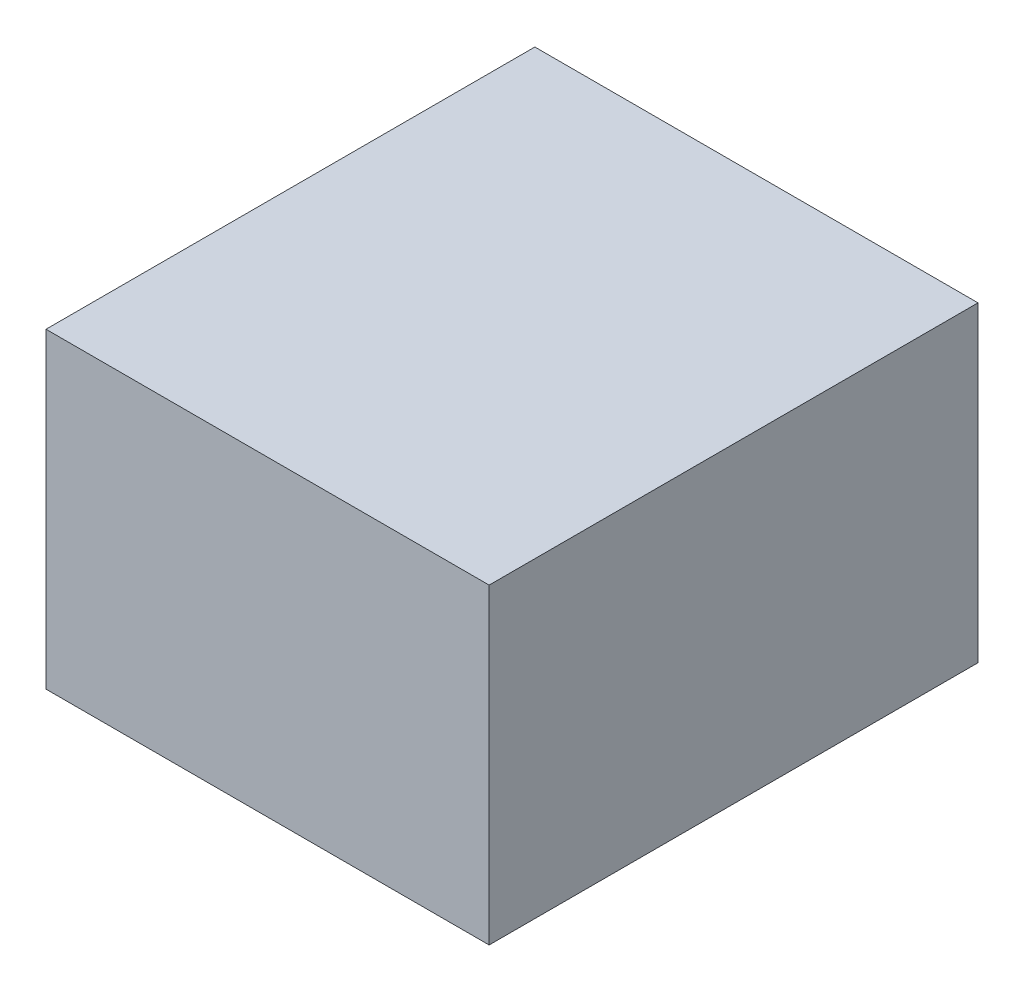
ISO-10303-21;
HEADER;
FILE_DESCRIPTION(('STEP AP214'),'2;1');
FILE_NAME('part.step','',(''),(''),'','','');
FILE_SCHEMA(('AUTOMOTIVE_DESIGN { 1 0 10303 214 1 1 1 1 }'));
ENDSEC;
DATA;
#1=APPLICATION_CONTEXT('core data for automotive mechanical design processes');
#2=APPLICATION_PROTOCOL_DEFINITION('international standard','automotive_design',2000,#1);
#3=PRODUCT_CONTEXT('',#1,'mechanical');
#4=PRODUCT('Part','Part','',(#3));
#5=PRODUCT_RELATED_PRODUCT_CATEGORY('part','',(#4));
#6=PRODUCT_DEFINITION_FORMATION('','',#4);
#7=PRODUCT_DEFINITION_CONTEXT('part definition',#1,'design');
#8=PRODUCT_DEFINITION('design','',#6,#7);
#9=PRODUCT_DEFINITION_SHAPE('','',#8);
#10=(LENGTH_UNIT() NAMED_UNIT(*) SI_UNIT(.MILLI.,.METRE.));
#11=(NAMED_UNIT(*) PLANE_ANGLE_UNIT() SI_UNIT($,.RADIAN.));
#12=(NAMED_UNIT(*) SI_UNIT($,.STERADIAN.) SOLID_ANGLE_UNIT());
#13=UNCERTAINTY_MEASURE_WITH_UNIT(LENGTH_MEASURE(1.E-05),#10,'distance_accuracy_value','');
#14=(GEOMETRIC_REPRESENTATION_CONTEXT(3) GLOBAL_UNCERTAINTY_ASSIGNED_CONTEXT((#13)) GLOBAL_UNIT_ASSIGNED_CONTEXT((#10,
#11,#12)) REPRESENTATION_CONTEXT('',''));
#15=CARTESIAN_POINT('',(0.,0.,0.));
#16=DIRECTION('',(0.,0.,1.));
#17=DIRECTION('',(1.,0.,0.));
#18=AXIS2_PLACEMENT_3D('',#15,#16,#17);
#19=CARTESIAN_POINT('',(0.,2.,0.));
#20=DIRECTION('',(1.,0.,0.));
#21=DIRECTION('',(0.,0.,-1.));
#22=AXIS2_PLACEMENT_3D('',#19,#20,#21);
#23=PLANE('',#22);
#24=DIRECTION('',(0.,0.,1.));
#25=VECTOR('',#24,1.);
#26=CARTESIAN_POINT('',(0.,0.,0.));
#27=LINE('',#26,#25);
#28=CARTESIAN_POINT('',(0.,0.,0.));
#29=VERTEX_POINT('',#28);
#30=CARTESIAN_POINT('',(0.,0.,3.13675937229618));
#31=VERTEX_POINT('',#30);
#32=EDGE_CURVE('E96',#29,#31,#27,.T.);
#33=ORIENTED_EDGE('',*,*,#32,.T.);
#34=DIRECTION('',(0.,-1.,0.));
#35=VECTOR('',#34,1.);
#36=CARTESIAN_POINT('',(0.,2.,3.13675937229618));
#37=LINE('',#36,#35);
#38=CARTESIAN_POINT('',(0.,2.,3.13675937229618));
#39=VERTEX_POINT('',#38);
#40=EDGE_CURVE('E11',#39,#31,#37,.T.);
#41=ORIENTED_EDGE('',*,*,#40,.F.);
#42=DIRECTION('',(0.,0.,1.));
#43=VECTOR('',#42,1.);
#44=CARTESIAN_POINT('',(0.,2.,0.));
#45=LINE('',#44,#43);
#46=CARTESIAN_POINT('',(0.,2.,0.));
#47=VERTEX_POINT('',#46);
#48=EDGE_CURVE('E84',#47,#39,#45,.T.);
#49=ORIENTED_EDGE('',*,*,#48,.F.);
#50=DIRECTION('',(0.,-1.,0.));
#51=VECTOR('',#50,1.);
#52=CARTESIAN_POINT('',(0.,2.,0.));
#53=LINE('',#52,#51);
#54=EDGE_CURVE('E92',#47,#29,#53,.T.);
#55=ORIENTED_EDGE('',*,*,#54,.T.);
#56=EDGE_LOOP('',(#33,#41,#49,#55));
#57=FACE_BOUND('',#56,.T.);
#58=ADVANCED_FACE('F33',(#57),#23,.F.);
#59=CARTESIAN_POINT('',(0.,2.,3.13675937229618));
#60=DIRECTION('',(0.,0.,-1.));
#61=DIRECTION('',(-1.,0.,0.));
#62=AXIS2_PLACEMENT_3D('',#59,#60,#61);
#63=PLANE('',#62);
#64=DIRECTION('',(1.,0.,0.));
#65=VECTOR('',#64,1.);
#66=CARTESIAN_POINT('',(0.,0.,3.13675937229618));
#67=LINE('',#66,#65);
#68=CARTESIAN_POINT('',(2.84343862136893,0.,3.13675937229618));
#69=VERTEX_POINT('',#68);
#70=EDGE_CURVE('E88',#31,#69,#67,.T.);
#71=ORIENTED_EDGE('',*,*,#70,.T.);
#72=DIRECTION('',(0.,-1.,0.));
#73=VECTOR('',#72,1.);
#74=CARTESIAN_POINT('',(2.84343862136893,2.,3.13675937229618));
#75=LINE('',#74,#73);
#76=CARTESIAN_POINT('',(2.84343862136893,2.,3.13675937229618));
#77=VERTEX_POINT('',#76);
#78=EDGE_CURVE('E41',#77,#69,#75,.T.);
#79=ORIENTED_EDGE('',*,*,#78,.F.);
#80=DIRECTION('',(1.,0.,0.));
#81=VECTOR('',#80,1.);
#82=CARTESIAN_POINT('',(0.,2.,3.13675937229618));
#83=LINE('',#82,#81);
#84=EDGE_CURVE('E79',#39,#77,#83,.T.);
#85=ORIENTED_EDGE('',*,*,#84,.F.);
#86=ORIENTED_EDGE('',*,*,#40,.T.);
#87=EDGE_LOOP('',(#71,#79,#85,#86));
#88=FACE_BOUND('',#87,.T.);
#89=ADVANCED_FACE('F87',(#88),#63,.F.);
#90=CARTESIAN_POINT('',(2.84343862136893,2.,0.));
#91=DIRECTION('',(-1.,0.,0.));
#92=DIRECTION('',(0.,0.,1.));
#93=AXIS2_PLACEMENT_3D('',#90,#91,#92);
#94=PLANE('',#93);
#95=DIRECTION('',(0.,0.,-1.));
#96=VECTOR('',#95,1.);
#97=CARTESIAN_POINT('',(2.84343862136893,0.,0.));
#98=LINE('',#97,#96);
#99=CARTESIAN_POINT('',(2.84343862136893,0.,0.));
#100=VERTEX_POINT('',#99);
#101=EDGE_CURVE('E66',#69,#100,#98,.T.);
#102=ORIENTED_EDGE('',*,*,#101,.T.);
#103=DIRECTION('',(0.,-1.,0.));
#104=VECTOR('',#103,1.);
#105=CARTESIAN_POINT('',(2.84343862136893,2.,0.));
#106=LINE('',#105,#104);
#107=CARTESIAN_POINT('',(2.84343862136893,2.,0.));
#108=VERTEX_POINT('',#107);
#109=EDGE_CURVE('E89',#108,#100,#106,.T.);
#110=ORIENTED_EDGE('',*,*,#109,.F.);
#111=DIRECTION('',(0.,0.,-1.));
#112=VECTOR('',#111,1.);
#113=CARTESIAN_POINT('',(2.84343862136893,2.,0.));
#114=LINE('',#113,#112);
#115=EDGE_CURVE('E82',#77,#108,#114,.T.);
#116=ORIENTED_EDGE('',*,*,#115,.F.);
#117=ORIENTED_EDGE('',*,*,#78,.T.);
#118=EDGE_LOOP('',(#102,#110,#116,#117));
#119=FACE_BOUND('',#118,.T.);
#120=ADVANCED_FACE('F90',(#119),#94,.F.);
#121=CARTESIAN_POINT('',(0.,2.,0.));
#122=DIRECTION('',(0.,0.,1.));
#123=DIRECTION('',(1.,0.,0.));
#124=AXIS2_PLACEMENT_3D('',#121,#122,#123);
#125=PLANE('',#124);
#126=DIRECTION('',(-1.,0.,0.));
#127=VECTOR('',#126,1.);
#128=CARTESIAN_POINT('',(0.,0.,0.));
#129=LINE('',#128,#127);
#130=EDGE_CURVE('E72',#100,#29,#129,.T.);
#131=ORIENTED_EDGE('',*,*,#130,.T.);
#132=ORIENTED_EDGE('',*,*,#54,.F.);
#133=DIRECTION('',(-1.,0.,0.));
#134=VECTOR('',#133,1.);
#135=CARTESIAN_POINT('',(0.,2.,0.));
#136=LINE('',#135,#134);
#137=EDGE_CURVE('E49',#108,#47,#136,.T.);
#138=ORIENTED_EDGE('',*,*,#137,.F.);
#139=ORIENTED_EDGE('',*,*,#109,.T.);
#140=EDGE_LOOP('',(#131,#132,#138,#139));
#141=FACE_BOUND('',#140,.T.);
#142=ADVANCED_FACE('F103',(#141),#125,.F.);
#143=CARTESIAN_POINT('',(0.,2.,0.));
#144=DIRECTION('',(0.,1.,0.));
#145=DIRECTION('',(0.,0.,1.));
#146=AXIS2_PLACEMENT_3D('',#143,#144,#145);
#147=PLANE('',#146);
#148=ORIENTED_EDGE('',*,*,#48,.T.);
#149=ORIENTED_EDGE('',*,*,#84,.T.);
#150=ORIENTED_EDGE('',*,*,#115,.T.);
#151=ORIENTED_EDGE('',*,*,#137,.T.);
#152=EDGE_LOOP('',(#148,#149,#150,#151));
#153=FACE_BOUND('',#152,.T.);
#154=ADVANCED_FACE('F80',(#153),#147,.T.);
#155=CARTESIAN_POINT('',(0.,0.,0.));
#156=DIRECTION('',(0.,1.,0.));
#157=DIRECTION('',(0.,0.,1.));
#158=AXIS2_PLACEMENT_3D('',#155,#156,#157);
#159=PLANE('',#158);
#160=ORIENTED_EDGE('',*,*,#32,.F.);
#161=ORIENTED_EDGE('',*,*,#130,.F.);
#162=ORIENTED_EDGE('',*,*,#101,.F.);
#163=ORIENTED_EDGE('',*,*,#70,.F.);
#164=EDGE_LOOP('',(#160,#161,#162,#163));
#165=FACE_BOUND('',#164,.T.);
#166=ADVANCED_FACE('F106',(#165),#159,.F.);
#167=CLOSED_SHELL('',(#58,#89,#120,#142,#154,#166));
#168=MANIFOLD_SOLID_BREP('B2',#167);
#169=ADVANCED_BREP_SHAPE_REPRESENTATION('',(#18,#168),#14);
#170=SHAPE_DEFINITION_REPRESENTATION(#9,#169);
ENDSEC;
END-ISO-10303-21;
